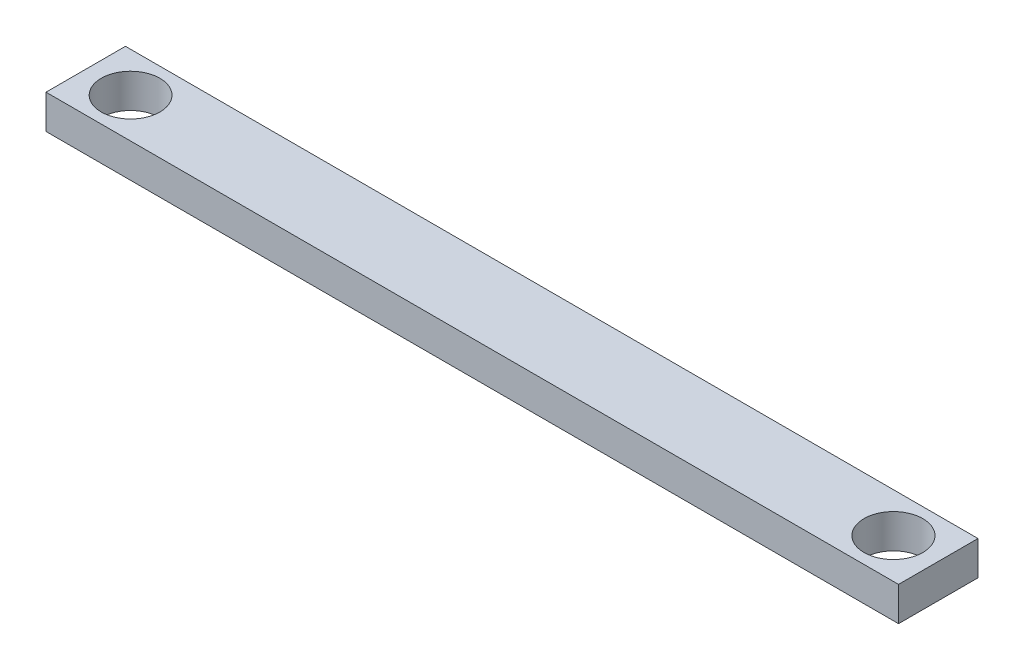
ISO-10303-21;
HEADER;
FILE_DESCRIPTION(('STEP AP214'),'2;1');
FILE_NAME('part.step','',(''),(''),'','','');
FILE_SCHEMA(('AUTOMOTIVE_DESIGN { 1 0 10303 214 1 1 1 1 }'));
ENDSEC;
DATA;
#1=APPLICATION_CONTEXT('core data for automotive mechanical design processes');
#2=APPLICATION_PROTOCOL_DEFINITION('international standard','automotive_design',2000,#1);
#3=PRODUCT_CONTEXT('',#1,'mechanical');
#4=PRODUCT('Part','Part','',(#3));
#5=PRODUCT_RELATED_PRODUCT_CATEGORY('part','',(#4));
#6=PRODUCT_DEFINITION_FORMATION('','',#4);
#7=PRODUCT_DEFINITION_CONTEXT('part definition',#1,'design');
#8=PRODUCT_DEFINITION('design','',#6,#7);
#9=PRODUCT_DEFINITION_SHAPE('','',#8);
#10=(LENGTH_UNIT() NAMED_UNIT(*) SI_UNIT(.MILLI.,.METRE.));
#11=(NAMED_UNIT(*) PLANE_ANGLE_UNIT() SI_UNIT($,.RADIAN.));
#12=(NAMED_UNIT(*) SI_UNIT($,.STERADIAN.) SOLID_ANGLE_UNIT());
#13=UNCERTAINTY_MEASURE_WITH_UNIT(LENGTH_MEASURE(1.E-05),#10,'distance_accuracy_value','');
#14=(GEOMETRIC_REPRESENTATION_CONTEXT(3) GLOBAL_UNCERTAINTY_ASSIGNED_CONTEXT((#13)) GLOBAL_UNIT_ASSIGNED_CONTEXT((#10,
#11,#12)) REPRESENTATION_CONTEXT('',''));
#15=CARTESIAN_POINT('',(0.,0.,0.));
#16=DIRECTION('',(0.,0.,1.));
#17=DIRECTION('',(1.,0.,0.));
#18=AXIS2_PLACEMENT_3D('',#15,#16,#17);
#19=CARTESIAN_POINT('',(0.,3.,0.));
#20=DIRECTION('',(0.,-1.,0.));
#21=DIRECTION('',(0.,0.,-1.));
#22=AXIS2_PLACEMENT_3D('',#19,#20,#21);
#23=PLANE('',#22);
#24=DIRECTION('',(0.,0.,-1.));
#25=VECTOR('',#24,1.);
#26=CARTESIAN_POINT('',(27.5,3.,2.5));
#27=LINE('',#26,#25);
#28=CARTESIAN_POINT('',(27.5,3.,2.5));
#29=VERTEX_POINT('',#28);
#30=CARTESIAN_POINT('',(27.5,3.,-4.5));
#31=VERTEX_POINT('',#30);
#32=EDGE_CURVE('E92',#29,#31,#27,.T.);
#33=ORIENTED_EDGE('',*,*,#32,.T.);
#34=DIRECTION('',(-1.,0.,0.));
#35=VECTOR('',#34,1.);
#36=CARTESIAN_POINT('',(-47.6,3.,-4.5));
#37=LINE('',#36,#35);
#38=CARTESIAN_POINT('',(-47.6,3.,-4.5));
#39=VERTEX_POINT('',#38);
#40=EDGE_CURVE('E87',#31,#39,#37,.T.);
#41=ORIENTED_EDGE('',*,*,#40,.T.);
#42=DIRECTION('',(0.,0.,1.));
#43=VECTOR('',#42,1.);
#44=CARTESIAN_POINT('',(-47.6,3.,2.5));
#45=LINE('',#44,#43);
#46=CARTESIAN_POINT('',(-47.6,3.,2.5));
#47=VERTEX_POINT('',#46);
#48=EDGE_CURVE('E90',#39,#47,#45,.T.);
#49=ORIENTED_EDGE('',*,*,#48,.T.);
#50=DIRECTION('',(1.,0.,0.));
#51=VECTOR('',#50,1.);
#52=CARTESIAN_POINT('',(-47.6,3.,2.5));
#53=LINE('',#52,#51);
#54=EDGE_CURVE('E57',#47,#29,#53,.T.);
#55=ORIENTED_EDGE('',*,*,#54,.T.);
#56=EDGE_LOOP('',(#33,#41,#49,#55));
#57=FACE_BOUND('',#56,.T.);
#58=CARTESIAN_POINT('',(-43.65,3.,-1.));
#59=DIRECTION('',(0.,1.,0.));
#60=DIRECTION('',(0.,0.,1.));
#61=AXIS2_PLACEMENT_3D('',#58,#59,#60);
#62=CIRCLE('',#61,2.58);
#63=CARTESIAN_POINT('',(-43.65,3.,1.58));
#64=VERTEX_POINT('',#63);
#65=EDGE_CURVE('E107',#64,#64,#62,.T.);
#66=ORIENTED_EDGE('',*,*,#65,.F.);
#67=EDGE_LOOP('',(#66));
#68=FACE_BOUND('',#67,.T.);
#69=CARTESIAN_POINT('',(23.55,3.,-1.));
#70=DIRECTION('',(0.,1.,0.));
#71=DIRECTION('',(0.,0.,1.));
#72=AXIS2_PLACEMENT_3D('',#69,#70,#71);
#73=CIRCLE('',#72,2.59);
#74=CARTESIAN_POINT('',(23.55,3.,1.59));
#75=VERTEX_POINT('',#74);
#76=EDGE_CURVE('E122',#75,#75,#73,.T.);
#77=ORIENTED_EDGE('',*,*,#76,.F.);
#78=EDGE_LOOP('',(#77));
#79=FACE_BOUND('',#78,.T.);
#80=ADVANCED_FACE('F40',(#57,#68,#79),#23,.F.);
#81=CARTESIAN_POINT('',(0.,0.,0.));
#82=DIRECTION('',(0.,-1.,0.));
#83=DIRECTION('',(0.,0.,-1.));
#84=AXIS2_PLACEMENT_3D('',#81,#82,#83);
#85=PLANE('',#84);
#86=CARTESIAN_POINT('',(-43.65,0.,-1.));
#87=DIRECTION('',(0.,1.,0.));
#88=DIRECTION('',(0.,0.,1.));
#89=AXIS2_PLACEMENT_3D('',#86,#87,#88);
#90=CIRCLE('',#89,2.58);
#91=CARTESIAN_POINT('',(-43.65,0.,1.58));
#92=VERTEX_POINT('',#91);
#93=EDGE_CURVE('E119',#92,#92,#90,.T.);
#94=ORIENTED_EDGE('',*,*,#93,.T.);
#95=EDGE_LOOP('',(#94));
#96=FACE_BOUND('',#95,.T.);
#97=DIRECTION('',(0.,0.,-1.));
#98=VECTOR('',#97,1.);
#99=CARTESIAN_POINT('',(27.5,0.,2.5));
#100=LINE('',#99,#98);
#101=CARTESIAN_POINT('',(27.5,0.,2.5));
#102=VERTEX_POINT('',#101);
#103=CARTESIAN_POINT('',(27.5,0.,-4.5));
#104=VERTEX_POINT('',#103);
#105=EDGE_CURVE('E104',#102,#104,#100,.T.);
#106=ORIENTED_EDGE('',*,*,#105,.F.);
#107=DIRECTION('',(1.,0.,0.));
#108=VECTOR('',#107,1.);
#109=CARTESIAN_POINT('',(-47.6,0.,2.5));
#110=LINE('',#109,#108);
#111=CARTESIAN_POINT('',(-47.6,0.,2.5));
#112=VERTEX_POINT('',#111);
#113=EDGE_CURVE('E80',#112,#102,#110,.T.);
#114=ORIENTED_EDGE('',*,*,#113,.F.);
#115=DIRECTION('',(0.,0.,1.));
#116=VECTOR('',#115,1.);
#117=CARTESIAN_POINT('',(-47.6,0.,2.5));
#118=LINE('',#117,#116);
#119=CARTESIAN_POINT('',(-47.6,0.,-4.5));
#120=VERTEX_POINT('',#119);
#121=EDGE_CURVE('E74',#120,#112,#118,.T.);
#122=ORIENTED_EDGE('',*,*,#121,.F.);
#123=DIRECTION('',(-1.,0.,0.));
#124=VECTOR('',#123,1.);
#125=CARTESIAN_POINT('',(-47.6,0.,-4.5));
#126=LINE('',#125,#124);
#127=EDGE_CURVE('E96',#104,#120,#126,.T.);
#128=ORIENTED_EDGE('',*,*,#127,.F.);
#129=EDGE_LOOP('',(#106,#114,#122,#128));
#130=FACE_BOUND('',#129,.T.);
#131=CARTESIAN_POINT('',(23.55,0.,-1.));
#132=DIRECTION('',(0.,1.,0.));
#133=DIRECTION('',(0.,0.,1.));
#134=AXIS2_PLACEMENT_3D('',#131,#132,#133);
#135=CIRCLE('',#134,2.59);
#136=CARTESIAN_POINT('',(23.55,0.,1.59));
#137=VERTEX_POINT('',#136);
#138=EDGE_CURVE('E125',#137,#137,#135,.T.);
#139=ORIENTED_EDGE('',*,*,#138,.T.);
#140=EDGE_LOOP('',(#139));
#141=FACE_BOUND('',#140,.T.);
#142=ADVANCED_FACE('F115',(#96,#130,#141),#85,.T.);
#143=CARTESIAN_POINT('',(27.5,3.,2.5));
#144=DIRECTION('',(-1.,0.,0.));
#145=DIRECTION('',(0.,0.,1.));
#146=AXIS2_PLACEMENT_3D('',#143,#144,#145);
#147=PLANE('',#146);
#148=ORIENTED_EDGE('',*,*,#105,.T.);
#149=DIRECTION('',(0.,-1.,0.));
#150=VECTOR('',#149,1.);
#151=CARTESIAN_POINT('',(27.5,3.,-4.5));
#152=LINE('',#151,#150);
#153=EDGE_CURVE('E11',#31,#104,#152,.T.);
#154=ORIENTED_EDGE('',*,*,#153,.F.);
#155=ORIENTED_EDGE('',*,*,#32,.F.);
#156=DIRECTION('',(0.,-1.,0.));
#157=VECTOR('',#156,1.);
#158=CARTESIAN_POINT('',(27.5,3.,2.5));
#159=LINE('',#158,#157);
#160=EDGE_CURVE('E100',#29,#102,#159,.T.);
#161=ORIENTED_EDGE('',*,*,#160,.T.);
#162=EDGE_LOOP('',(#148,#154,#155,#161));
#163=FACE_BOUND('',#162,.T.);
#164=ADVANCED_FACE('F42',(#163),#147,.F.);
#165=CARTESIAN_POINT('',(-47.6,3.,-4.5));
#166=DIRECTION('',(0.,0.,1.));
#167=DIRECTION('',(1.,0.,0.));
#168=AXIS2_PLACEMENT_3D('',#165,#166,#167);
#169=PLANE('',#168);
#170=ORIENTED_EDGE('',*,*,#127,.T.);
#171=DIRECTION('',(0.,-1.,0.));
#172=VECTOR('',#171,1.);
#173=CARTESIAN_POINT('',(-47.6,3.,-4.5));
#174=LINE('',#173,#172);
#175=EDGE_CURVE('E49',#39,#120,#174,.T.);
#176=ORIENTED_EDGE('',*,*,#175,.F.);
#177=ORIENTED_EDGE('',*,*,#40,.F.);
#178=ORIENTED_EDGE('',*,*,#153,.T.);
#179=EDGE_LOOP('',(#170,#176,#177,#178));
#180=FACE_BOUND('',#179,.T.);
#181=ADVANCED_FACE('F95',(#180),#169,.F.);
#182=CARTESIAN_POINT('',(-47.6,3.,2.5));
#183=DIRECTION('',(1.,0.,0.));
#184=DIRECTION('',(0.,0.,-1.));
#185=AXIS2_PLACEMENT_3D('',#182,#183,#184);
#186=PLANE('',#185);
#187=ORIENTED_EDGE('',*,*,#121,.T.);
#188=DIRECTION('',(0.,-1.,0.));
#189=VECTOR('',#188,1.);
#190=CARTESIAN_POINT('',(-47.6,3.,2.5));
#191=LINE('',#190,#189);
#192=EDGE_CURVE('E97',#47,#112,#191,.T.);
#193=ORIENTED_EDGE('',*,*,#192,.F.);
#194=ORIENTED_EDGE('',*,*,#48,.F.);
#195=ORIENTED_EDGE('',*,*,#175,.T.);
#196=EDGE_LOOP('',(#187,#193,#194,#195));
#197=FACE_BOUND('',#196,.T.);
#198=ADVANCED_FACE('F98',(#197),#186,.F.);
#199=CARTESIAN_POINT('',(-47.6,3.,2.5));
#200=DIRECTION('',(0.,0.,-1.));
#201=DIRECTION('',(-1.,0.,0.));
#202=AXIS2_PLACEMENT_3D('',#199,#200,#201);
#203=PLANE('',#202);
#204=ORIENTED_EDGE('',*,*,#113,.T.);
#205=ORIENTED_EDGE('',*,*,#160,.F.);
#206=ORIENTED_EDGE('',*,*,#54,.F.);
#207=ORIENTED_EDGE('',*,*,#192,.T.);
#208=EDGE_LOOP('',(#204,#205,#206,#207));
#209=FACE_BOUND('',#208,.T.);
#210=ADVANCED_FACE('F112',(#209),#203,.F.);
#211=CARTESIAN_POINT('',(-43.65,3.,-1.));
#212=DIRECTION('',(0.,-1.,0.));
#213=DIRECTION('',(0.,0.,-1.));
#214=AXIS2_PLACEMENT_3D('',#211,#212,#213);
#215=CYLINDRICAL_SURFACE('',#214,2.58);
#216=ORIENTED_EDGE('',*,*,#65,.T.);
#217=EDGE_LOOP('',(#216));
#218=FACE_BOUND('',#217,.T.);
#219=ORIENTED_EDGE('',*,*,#93,.F.);
#220=EDGE_LOOP('',(#219));
#221=FACE_BOUND('',#220,.T.);
#222=ADVANCED_FACE('F142',(#218,#221),#215,.F.);
#223=CARTESIAN_POINT('',(23.55,3.,-1.));
#224=DIRECTION('',(0.,-1.,0.));
#225=DIRECTION('',(0.,0.,-1.));
#226=AXIS2_PLACEMENT_3D('',#223,#224,#225);
#227=CYLINDRICAL_SURFACE('',#226,2.59);
#228=ORIENTED_EDGE('',*,*,#76,.T.);
#229=EDGE_LOOP('',(#228));
#230=FACE_BOUND('',#229,.T.);
#231=ORIENTED_EDGE('',*,*,#138,.F.);
#232=EDGE_LOOP('',(#231));
#233=FACE_BOUND('',#232,.T.);
#234=ADVANCED_FACE('F131',(#230,#233),#227,.F.);
#235=CLOSED_SHELL('',(#80,#142,#164,#181,#198,#210,#222,#234));
#236=MANIFOLD_SOLID_BREP('B2',#235);
#237=ADVANCED_BREP_SHAPE_REPRESENTATION('',(#18,#236),#14);
#238=SHAPE_DEFINITION_REPRESENTATION(#9,#237);
ENDSEC;
END-ISO-10303-21;
